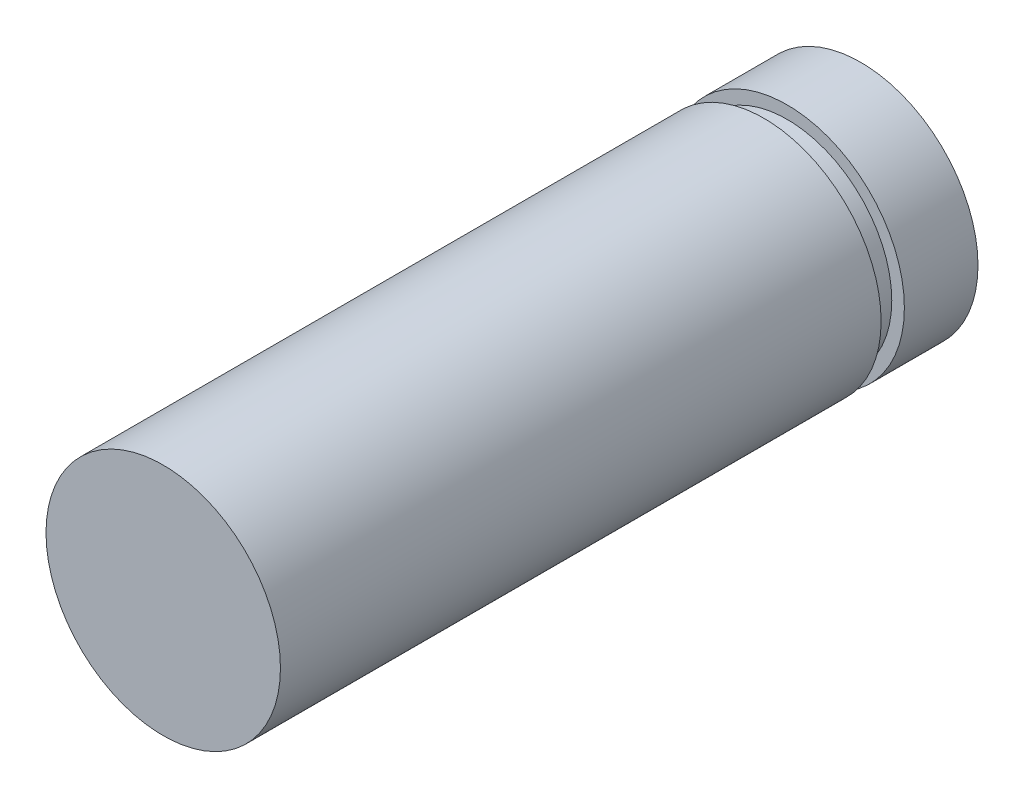
ISO-10303-21;
HEADER;
FILE_DESCRIPTION(('STEP AP214'),'2;1');
FILE_NAME('part.step','',(''),(''),'','','');
FILE_SCHEMA(('AUTOMOTIVE_DESIGN { 1 0 10303 214 1 1 1 1 }'));
ENDSEC;
DATA;
#1=APPLICATION_CONTEXT('core data for automotive mechanical design processes');
#2=APPLICATION_PROTOCOL_DEFINITION('international standard','automotive_design',2000,#1);
#3=PRODUCT_CONTEXT('',#1,'mechanical');
#4=PRODUCT('Part','Part','',(#3));
#5=PRODUCT_RELATED_PRODUCT_CATEGORY('part','',(#4));
#6=PRODUCT_DEFINITION_FORMATION('','',#4);
#7=PRODUCT_DEFINITION_CONTEXT('part definition',#1,'design');
#8=PRODUCT_DEFINITION('design','',#6,#7);
#9=PRODUCT_DEFINITION_SHAPE('','',#8);
#10=(LENGTH_UNIT() NAMED_UNIT(*) SI_UNIT(.MILLI.,.METRE.));
#11=(NAMED_UNIT(*) PLANE_ANGLE_UNIT() SI_UNIT($,.RADIAN.));
#12=(NAMED_UNIT(*) SI_UNIT($,.STERADIAN.) SOLID_ANGLE_UNIT());
#13=UNCERTAINTY_MEASURE_WITH_UNIT(LENGTH_MEASURE(1.E-05),#10,'distance_accuracy_value','');
#14=(GEOMETRIC_REPRESENTATION_CONTEXT(3) GLOBAL_UNCERTAINTY_ASSIGNED_CONTEXT((#13)) GLOBAL_UNIT_ASSIGNED_CONTEXT((#10,
#11,#12)) REPRESENTATION_CONTEXT('',''));
#15=CARTESIAN_POINT('',(0.,0.,0.));
#16=DIRECTION('',(0.,0.,1.));
#17=DIRECTION('',(1.,0.,0.));
#18=AXIS2_PLACEMENT_3D('',#15,#16,#17);
#19=CARTESIAN_POINT('',(0.,0.,18.));
#20=DIRECTION('',(0.,0.,-1.));
#21=DIRECTION('',(-1.,0.,0.));
#22=AXIS2_PLACEMENT_3D('',#19,#20,#21);
#23=CYLINDRICAL_SURFACE('',#22,3.025);
#24=CARTESIAN_POINT('',(0.,0.,18.));
#25=DIRECTION('',(0.,0.,1.));
#26=DIRECTION('',(1.,0.,0.));
#27=AXIS2_PLACEMENT_3D('',#24,#25,#26);
#28=CIRCLE('',#27,3.025);
#29=CARTESIAN_POINT('',(3.025,0.,18.));
#30=VERTEX_POINT('',#29);
#31=EDGE_CURVE('E10',#30,#30,#28,.T.);
#32=ORIENTED_EDGE('',*,*,#31,.F.);
#33=EDGE_LOOP('',(#32));
#34=FACE_BOUND('',#33,.T.);
#35=CARTESIAN_POINT('',(0.,0.,2.5));
#36=DIRECTION('',(0.,0.,-1.));
#37=DIRECTION('',(-1.,0.,0.));
#38=AXIS2_PLACEMENT_3D('',#35,#36,#37);
#39=CIRCLE('',#38,3.025);
#40=CARTESIAN_POINT('',(-3.025,0.,2.5));
#41=VERTEX_POINT('',#40);
#42=EDGE_CURVE('E33',#41,#41,#39,.T.);
#43=ORIENTED_EDGE('',*,*,#42,.F.);
#44=EDGE_LOOP('',(#43));
#45=FACE_BOUND('',#44,.T.);
#46=ADVANCED_FACE('F30',(#34,#45),#23,.T.);
#47=CARTESIAN_POINT('',(0.,0.,18.));
#48=DIRECTION('',(0.,0.,1.));
#49=DIRECTION('',(1.,0.,0.));
#50=AXIS2_PLACEMENT_3D('',#47,#48,#49);
#51=PLANE('',#50);
#52=ORIENTED_EDGE('',*,*,#31,.T.);
#53=EDGE_LOOP('',(#52));
#54=FACE_BOUND('',#53,.T.);
#55=ADVANCED_FACE('F75',(#54),#51,.T.);
#56=CARTESIAN_POINT('',(0.,4.1,2.5));
#57=DIRECTION('',(0.,0.,-1.));
#58=DIRECTION('',(-1.,0.,0.));
#59=AXIS2_PLACEMENT_3D('',#56,#57,#58);
#60=PLANE('',#59);
#61=CARTESIAN_POINT('',(0.,0.,2.5));
#62=DIRECTION('',(0.,0.,-1.));
#63=DIRECTION('',(-1.,0.,0.));
#64=AXIS2_PLACEMENT_3D('',#61,#62,#63);
#65=CIRCLE('',#64,2.7);
#66=CARTESIAN_POINT('',(-2.7,0.,2.5));
#67=VERTEX_POINT('',#66);
#68=EDGE_CURVE('E44',#67,#67,#65,.T.);
#69=ORIENTED_EDGE('',*,*,#68,.F.);
#70=EDGE_LOOP('',(#69));
#71=FACE_BOUND('',#70,.T.);
#72=ORIENTED_EDGE('',*,*,#42,.T.);
#73=EDGE_LOOP('',(#72));
#74=FACE_BOUND('',#73,.T.);
#75=ADVANCED_FACE('F70',(#71,#74),#60,.T.);
#76=CARTESIAN_POINT('',(0.,2.7,1.9));
#77=DIRECTION('',(0.,0.,1.));
#78=DIRECTION('',(1.,0.,0.));
#79=AXIS2_PLACEMENT_3D('',#76,#77,#78);
#80=PLANE('',#79);
#81=CARTESIAN_POINT('',(0.,0.,1.9));
#82=DIRECTION('',(0.,0.,-1.));
#83=DIRECTION('',(-1.,0.,0.));
#84=AXIS2_PLACEMENT_3D('',#81,#82,#83);
#85=CIRCLE('',#84,2.7);
#86=CARTESIAN_POINT('',(-2.7,0.,1.9));
#87=VERTEX_POINT('',#86);
#88=EDGE_CURVE('E52',#87,#87,#85,.T.);
#89=ORIENTED_EDGE('',*,*,#88,.T.);
#90=EDGE_LOOP('',(#89));
#91=FACE_BOUND('',#90,.T.);
#92=CARTESIAN_POINT('',(0.,0.,1.9));
#93=DIRECTION('',(0.,0.,1.));
#94=DIRECTION('',(1.,0.,0.));
#95=AXIS2_PLACEMENT_3D('',#92,#93,#94);
#96=CIRCLE('',#95,3.025);
#97=CARTESIAN_POINT('',(3.025,0.,1.9));
#98=VERTEX_POINT('',#97);
#99=EDGE_CURVE('E46',#98,#98,#96,.T.);
#100=ORIENTED_EDGE('',*,*,#99,.T.);
#101=EDGE_LOOP('',(#100));
#102=FACE_BOUND('',#101,.T.);
#103=ADVANCED_FACE('F58',(#91,#102),#80,.T.);
#104=CARTESIAN_POINT('',(0.,0.,68.));
#105=DIRECTION('',(0.,0.,-1.));
#106=DIRECTION('',(-1.,0.,0.));
#107=AXIS2_PLACEMENT_3D('',#104,#105,#106);
#108=CYLINDRICAL_SURFACE('',#107,2.7);
#109=ORIENTED_EDGE('',*,*,#68,.T.);
#110=EDGE_LOOP('',(#109));
#111=FACE_BOUND('',#110,.T.);
#112=ORIENTED_EDGE('',*,*,#88,.F.);
#113=EDGE_LOOP('',(#112));
#114=FACE_BOUND('',#113,.T.);
#115=ADVANCED_FACE('F60',(#111,#114),#108,.T.);
#116=CARTESIAN_POINT('',(0.,0.,0.));
#117=DIRECTION('',(0.,0.,1.));
#118=DIRECTION('',(1.,0.,0.));
#119=AXIS2_PLACEMENT_3D('',#116,#117,#118);
#120=PLANE('',#119);
#121=CARTESIAN_POINT('',(0.,0.,0.));
#122=DIRECTION('',(0.,0.,1.));
#123=DIRECTION('',(1.,0.,0.));
#124=AXIS2_PLACEMENT_3D('',#121,#122,#123);
#125=CIRCLE('',#124,3.025);
#126=CARTESIAN_POINT('',(3.025,0.,0.));
#127=VERTEX_POINT('',#126);
#128=EDGE_CURVE('E37',#127,#127,#125,.T.);
#129=ORIENTED_EDGE('',*,*,#128,.F.);
#130=EDGE_LOOP('',(#129));
#131=FACE_BOUND('',#130,.T.);
#132=ADVANCED_FACE('F62',(#131),#120,.F.);
#133=ORIENTED_EDGE('',*,*,#128,.T.);
#134=EDGE_LOOP('',(#133));
#135=FACE_BOUND('',#134,.T.);
#136=ORIENTED_EDGE('',*,*,#99,.F.);
#137=EDGE_LOOP('',(#136));
#138=FACE_BOUND('',#137,.T.);
#139=ADVANCED_FACE('F68',(#135,#138),#23,.T.);
#140=CLOSED_SHELL('',(#46,#55,#75,#103,#115,#132,#139));
#141=MANIFOLD_SOLID_BREP('B2',#140);
#142=ADVANCED_BREP_SHAPE_REPRESENTATION('',(#18,#141),#14);
#143=SHAPE_DEFINITION_REPRESENTATION(#9,#142);
ENDSEC;
END-ISO-10303-21;
